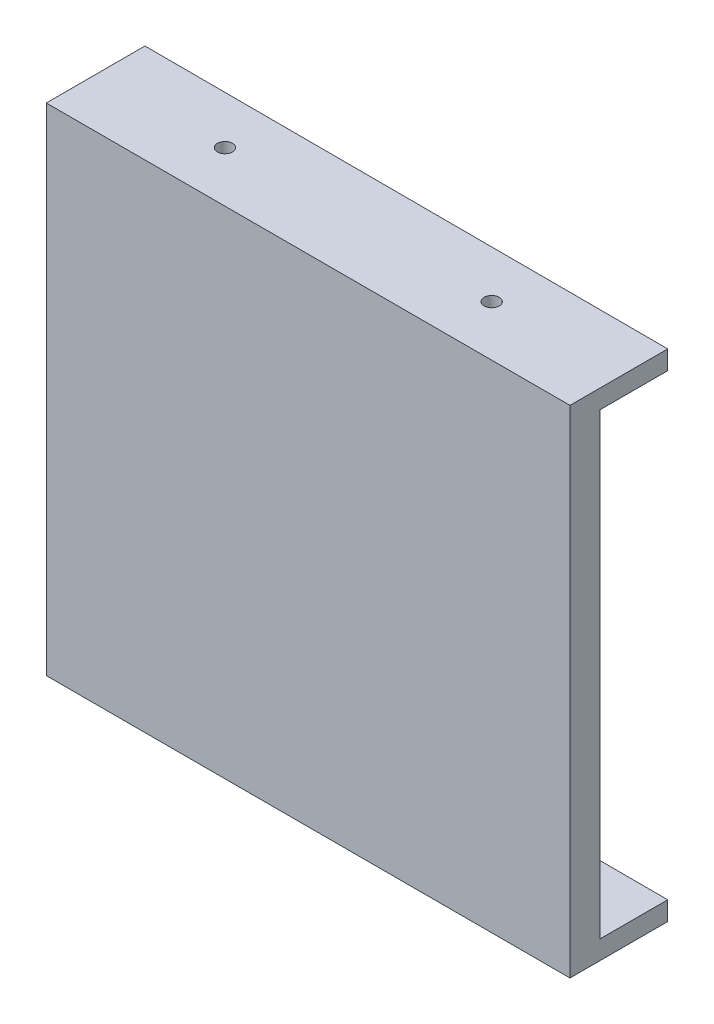
ISO-10303-21;
HEADER;
FILE_DESCRIPTION(('STEP AP214'),'2;1');
FILE_NAME('part.step','',(''),(''),'','','');
FILE_SCHEMA(('AUTOMOTIVE_DESIGN { 1 0 10303 214 1 1 1 1 }'));
ENDSEC;
DATA;
#1=APPLICATION_CONTEXT('core data for automotive mechanical design processes');
#2=APPLICATION_PROTOCOL_DEFINITION('international standard','automotive_design',2000,#1);
#3=PRODUCT_CONTEXT('',#1,'mechanical');
#4=PRODUCT('Part','Part','',(#3));
#5=PRODUCT_RELATED_PRODUCT_CATEGORY('part','',(#4));
#6=PRODUCT_DEFINITION_FORMATION('','',#4);
#7=PRODUCT_DEFINITION_CONTEXT('part definition',#1,'design');
#8=PRODUCT_DEFINITION('design','',#6,#7);
#9=PRODUCT_DEFINITION_SHAPE('','',#8);
#10=(LENGTH_UNIT() NAMED_UNIT(*) SI_UNIT(.MILLI.,.METRE.));
#11=(NAMED_UNIT(*) PLANE_ANGLE_UNIT() SI_UNIT($,.RADIAN.));
#12=(NAMED_UNIT(*) SI_UNIT($,.STERADIAN.) SOLID_ANGLE_UNIT());
#13=UNCERTAINTY_MEASURE_WITH_UNIT(LENGTH_MEASURE(1.E-05),#10,'distance_accuracy_value','');
#14=(GEOMETRIC_REPRESENTATION_CONTEXT(3) GLOBAL_UNCERTAINTY_ASSIGNED_CONTEXT((#13)) GLOBAL_UNIT_ASSIGNED_CONTEXT((#10,
#11,#12)) REPRESENTATION_CONTEXT('',''));
#15=CARTESIAN_POINT('',(0.,0.,0.));
#16=DIRECTION('',(0.,0.,1.));
#17=DIRECTION('',(1.,0.,0.));
#18=AXIS2_PLACEMENT_3D('',#15,#16,#17);
#19=CARTESIAN_POINT('',(52.325901310465,-131.475201728889,-26.1629504065637));
#20=DIRECTION('',(-0.00180058932844501,0.,0.999998378937721));
#21=DIRECTION('',(0.999998378937721,0.,0.00180058932844501));
#22=AXIS2_PLACEMENT_3D('',#19,#20,#21);
#23=PLANE('',#22);
#24=DIRECTION('',(-0.999998378937721,0.,-0.00180058932844501));
#25=VECTOR('',#24,1.);
#26=CARTESIAN_POINT('',(52.0759654345378,-131.475201728889,-26.1634004391642));
#27=LINE('',#26,#25);
#28=CARTESIAN_POINT('',(191.168830920369,-131.475201728889,-25.9129509039133));
#29=VERTEX_POINT('',#28);
#30=CARTESIAN_POINT('',(135.61271205082,-131.475201728889,-26.0129848208408));
#31=VERTEX_POINT('',#30);
#32=EDGE_CURVE('E161',#29,#31,#27,.T.);
#33=ORIENTED_EDGE('',*,*,#32,.T.);
#34=DIRECTION('',(0.,-1.,0.));
#35=VECTOR('',#34,1.);
#36=CARTESIAN_POINT('',(135.61271205082,0.001000000000001,-26.0129848208408));
#37=LINE('',#36,#35);
#38=CARTESIAN_POINT('',(135.61271205082,-126.475201728889,-26.0129848208408));
#39=VERTEX_POINT('',#38);
#40=EDGE_CURVE('E236',#39,#31,#37,.T.);
#41=ORIENTED_EDGE('',*,*,#40,.F.);
#42=DIRECTION('',(0.999998378937721,0.,0.00180058932844501));
#43=VECTOR('',#42,1.);
#44=CARTESIAN_POINT('',(52.0759654345378,-126.475201728889,-26.1634004391642));
#45=LINE('',#44,#43);
#46=CARTESIAN_POINT('',(191.168830920369,-126.475201728889,-25.9129509039133));
#47=VERTEX_POINT('',#46);
#48=EDGE_CURVE('E149',#39,#47,#45,.T.);
#49=ORIENTED_EDGE('',*,*,#48,.T.);
#50=DIRECTION('',(0.,-1.,0.));
#51=VECTOR('',#50,1.);
#52=CARTESIAN_POINT('',(191.168830920369,-131.475201728889,-25.9129509039133));
#53=LINE('',#52,#51);
#54=EDGE_CURVE('E153',#47,#29,#53,.T.);
#55=ORIENTED_EDGE('',*,*,#54,.T.);
#56=EDGE_LOOP('',(#33,#41,#49,#55));
#57=FACE_BOUND('',#56,.T.);
#58=ADVANCED_FACE('F36',(#57),#23,.F.);
#59=CARTESIAN_POINT('',(52.3259013104651,0.,-8.));
#60=DIRECTION('',(-1.,0.,0.));
#61=DIRECTION('',(0.,0.,1.));
#62=AXIS2_PLACEMENT_3D('',#59,#60,#61);
#63=PLANE('',#62);
#64=DIRECTION('',(0.,-1.,0.));
#65=VECTOR('',#64,1.);
#66=CARTESIAN_POINT('',(52.3259013104651,0.,-8.));
#67=LINE('',#66,#65);
#68=CARTESIAN_POINT('',(52.3259013104651,-5.,-8.00000000000001));
#69=VERTEX_POINT('',#68);
#70=CARTESIAN_POINT('',(52.3259013104651,-126.475201728889,-8.00000000000001));
#71=VERTEX_POINT('',#70);
#72=EDGE_CURVE('E186',#69,#71,#67,.T.);
#73=ORIENTED_EDGE('',*,*,#72,.T.);
#74=DIRECTION('',(0.,0.,1.));
#75=VECTOR('',#74,1.);
#76=CARTESIAN_POINT('',(52.3259013104651,-126.475201728889,-164.970993496207));
#77=LINE('',#76,#75);
#78=CARTESIAN_POINT('',(52.3259013104651,-126.475201728889,-26.1629504065637));
#79=VERTEX_POINT('',#78);
#80=EDGE_CURVE('E157',#79,#71,#77,.T.);
#81=ORIENTED_EDGE('',*,*,#80,.F.);
#82=DIRECTION('',(0.,1.,0.));
#83=VECTOR('',#82,1.);
#84=CARTESIAN_POINT('',(52.3259013104651,-131.475201728889,-26.1629504065637));
#85=LINE('',#84,#83);
#86=CARTESIAN_POINT('',(52.3259013104651,-131.475201728889,-26.1629504065637));
#87=VERTEX_POINT('',#86);
#88=EDGE_CURVE('E148',#87,#79,#85,.T.);
#89=ORIENTED_EDGE('',*,*,#88,.F.);
#90=DIRECTION('',(0.,0.,1.));
#91=VECTOR('',#90,1.);
#92=CARTESIAN_POINT('',(52.3259013104651,-131.475201728889,-8.));
#93=LINE('',#92,#91);
#94=CARTESIAN_POINT('',(52.3259013104651,-131.475201728889,0.));
#95=VERTEX_POINT('',#94);
#96=EDGE_CURVE('E191',#87,#95,#93,.T.);
#97=ORIENTED_EDGE('',*,*,#96,.T.);
#98=DIRECTION('',(0.,-1.,0.));
#99=VECTOR('',#98,1.);
#100=CARTESIAN_POINT('',(52.3259013104651,0.,0.));
#101=LINE('',#100,#99);
#102=CARTESIAN_POINT('',(52.3259013104651,0.,0.));
#103=VERTEX_POINT('',#102);
#104=EDGE_CURVE('E185',#103,#95,#101,.T.);
#105=ORIENTED_EDGE('',*,*,#104,.F.);
#106=DIRECTION('',(0.,0.,1.));
#107=VECTOR('',#106,1.);
#108=CARTESIAN_POINT('',(52.3259013104651,0.,-8.));
#109=LINE('',#108,#107);
#110=CARTESIAN_POINT('',(52.3259013104651,0.,-26.1629504065637));
#111=VERTEX_POINT('',#110);
#112=EDGE_CURVE('E11',#111,#103,#109,.T.);
#113=ORIENTED_EDGE('',*,*,#112,.F.);
#114=DIRECTION('',(0.,1.,0.));
#115=VECTOR('',#114,1.);
#116=CARTESIAN_POINT('',(52.3259013104651,0.,-26.1629504065637));
#117=LINE('',#116,#115);
#118=CARTESIAN_POINT('',(52.3259013104651,-5.,-26.1629504065637));
#119=VERTEX_POINT('',#118);
#120=EDGE_CURVE('E174',#119,#111,#117,.T.);
#121=ORIENTED_EDGE('',*,*,#120,.F.);
#122=DIRECTION('',(0.,0.,1.));
#123=VECTOR('',#122,1.);
#124=CARTESIAN_POINT('',(52.3259013104651,-5.,-164.970993496207));
#125=LINE('',#124,#123);
#126=EDGE_CURVE('E167',#119,#69,#125,.T.);
#127=ORIENTED_EDGE('',*,*,#126,.T.);
#128=EDGE_LOOP('',(#73,#81,#89,#97,#105,#113,#121,#127));
#129=FACE_BOUND('',#128,.T.);
#130=ADVANCED_FACE('F38',(#129),#63,.T.);
#131=CARTESIAN_POINT('',(52.3259013104651,0.,-8.));
#132=DIRECTION('',(0.,1.,0.));
#133=DIRECTION('',(0.,0.,1.));
#134=AXIS2_PLACEMENT_3D('',#131,#132,#133);
#135=PLANE('',#134);
#136=CARTESIAN_POINT('',(86.2670273047564,0.,-13.4350288425471));
#137=DIRECTION('',(0.,-1.,0.));
#138=DIRECTION('',(0.,0.,-1.));
#139=AXIS2_PLACEMENT_3D('',#136,#137,#138);
#140=CIRCLE('',#139,1.99999999999897);
#141=CARTESIAN_POINT('',(86.2670273047564,0.,-15.4350288425461));
#142=VERTEX_POINT('',#141);
#143=EDGE_CURVE('E208',#142,#142,#140,.T.);
#144=ORIENTED_EDGE('',*,*,#143,.T.);
#145=EDGE_LOOP('',(#144));
#146=FACE_BOUND('',#145,.T.);
#147=CARTESIAN_POINT('',(156.977705423411,0.,-13.4350288425517));
#148=DIRECTION('',(0.,-1.,0.));
#149=DIRECTION('',(0.,0.,-1.));
#150=AXIS2_PLACEMENT_3D('',#147,#148,#149);
#151=CIRCLE('',#150,1.99999999999892);
#152=CARTESIAN_POINT('',(156.977705423411,0.,-15.4350288425507));
#153=VERTEX_POINT('',#152);
#154=EDGE_CURVE('E219',#153,#153,#151,.T.);
#155=ORIENTED_EDGE('',*,*,#154,.T.);
#156=EDGE_LOOP('',(#155));
#157=FACE_BOUND('',#156,.T.);
#158=DIRECTION('',(-1.,0.,0.));
#159=VECTOR('',#158,1.);
#160=CARTESIAN_POINT('',(52.3259013104651,0.,0.));
#161=LINE('',#160,#159);
#162=CARTESIAN_POINT('',(191.168830920369,0.,0.));
#163=VERTEX_POINT('',#162);
#164=EDGE_CURVE('E189',#163,#103,#161,.T.);
#165=ORIENTED_EDGE('',*,*,#164,.F.);
#166=DIRECTION('',(0.,0.,1.));
#167=VECTOR('',#166,1.);
#168=CARTESIAN_POINT('',(191.168830920369,0.,-8.));
#169=LINE('',#168,#167);
#170=CARTESIAN_POINT('',(191.168830920369,0.,-25.9129509039132));
#171=VERTEX_POINT('',#170);
#172=EDGE_CURVE('E45',#171,#163,#169,.T.);
#173=ORIENTED_EDGE('',*,*,#172,.F.);
#174=DIRECTION('',(0.999998378937721,0.,0.00180058932844501));
#175=VECTOR('',#174,1.);
#176=CARTESIAN_POINT('',(52.0759654345378,0.,-26.1634004391642));
#177=LINE('',#176,#175);
#178=EDGE_CURVE('E170',#111,#171,#177,.T.);
#179=ORIENTED_EDGE('',*,*,#178,.F.);
#180=ORIENTED_EDGE('',*,*,#112,.T.);
#181=EDGE_LOOP('',(#165,#173,#179,#180));
#182=FACE_BOUND('',#181,.T.);
#183=ADVANCED_FACE('F273',(#146,#157,#182),#135,.T.);
#184=CARTESIAN_POINT('',(191.168830920369,0.,-8.));
#185=DIRECTION('',(1.,0.,0.));
#186=DIRECTION('',(0.,0.,-1.));
#187=AXIS2_PLACEMENT_3D('',#184,#185,#186);
#188=PLANE('',#187);
#189=ORIENTED_EDGE('',*,*,#172,.T.);
#190=DIRECTION('',(0.,1.,0.));
#191=VECTOR('',#190,1.);
#192=CARTESIAN_POINT('',(191.168830920369,0.,0.));
#193=LINE('',#192,#191);
#194=CARTESIAN_POINT('',(191.168830920369,-131.475201728889,0.));
#195=VERTEX_POINT('',#194);
#196=EDGE_CURVE('E196',#195,#163,#193,.T.);
#197=ORIENTED_EDGE('',*,*,#196,.F.);
#198=DIRECTION('',(0.,0.,1.));
#199=VECTOR('',#198,1.);
#200=CARTESIAN_POINT('',(191.168830920369,-131.475201728889,-8.));
#201=LINE('',#200,#199);
#202=EDGE_CURVE('E202',#29,#195,#201,.T.);
#203=ORIENTED_EDGE('',*,*,#202,.F.);
#204=ORIENTED_EDGE('',*,*,#54,.F.);
#205=DIRECTION('',(0.,0.,1.));
#206=VECTOR('',#205,1.);
#207=CARTESIAN_POINT('',(191.168830920369,-126.475201728889,-164.970993496207));
#208=LINE('',#207,#206);
#209=CARTESIAN_POINT('',(191.168830920369,-126.475201728889,-8.00000000000001));
#210=VERTEX_POINT('',#209);
#211=EDGE_CURVE('E159',#47,#210,#208,.T.);
#212=ORIENTED_EDGE('',*,*,#211,.T.);
#213=DIRECTION('',(0.,1.,0.));
#214=VECTOR('',#213,1.);
#215=CARTESIAN_POINT('',(191.168830920369,0.,-8.));
#216=LINE('',#215,#214);
#217=CARTESIAN_POINT('',(191.168830920369,-5.,-8.));
#218=VERTEX_POINT('',#217);
#219=EDGE_CURVE('E61',#210,#218,#216,.T.);
#220=ORIENTED_EDGE('',*,*,#219,.T.);
#221=DIRECTION('',(0.,0.,1.));
#222=VECTOR('',#221,1.);
#223=CARTESIAN_POINT('',(191.168830920369,-5.,-164.970993496207));
#224=LINE('',#223,#222);
#225=CARTESIAN_POINT('',(191.168830920369,-5.,-25.9129509039132));
#226=VERTEX_POINT('',#225);
#227=EDGE_CURVE('E171',#226,#218,#224,.T.);
#228=ORIENTED_EDGE('',*,*,#227,.F.);
#229=DIRECTION('',(0.,-1.,0.));
#230=VECTOR('',#229,1.);
#231=CARTESIAN_POINT('',(191.168830920369,0.,-25.9129509039132));
#232=LINE('',#231,#230);
#233=EDGE_CURVE('E168',#171,#226,#232,.T.);
#234=ORIENTED_EDGE('',*,*,#233,.F.);
#235=EDGE_LOOP('',(#189,#197,#203,#204,#212,#220,#228,#234));
#236=FACE_BOUND('',#235,.T.);
#237=ADVANCED_FACE('F304',(#236),#188,.T.);
#238=CARTESIAN_POINT('',(52.3259013104651,-131.475201728889,-8.));
#239=DIRECTION('',(0.,-1.,0.));
#240=DIRECTION('',(0.,0.,-1.));
#241=AXIS2_PLACEMENT_3D('',#238,#239,#240);
#242=PLANE('',#241);
#243=CARTESIAN_POINT('',(86.2670273047564,-131.475201728889,-13.4350288425471));
#244=DIRECTION('',(0.,-1.,0.));
#245=DIRECTION('',(0.,0.,-1.));
#246=AXIS2_PLACEMENT_3D('',#243,#244,#245);
#247=CIRCLE('',#246,1.99999999999897);
#248=CARTESIAN_POINT('',(86.2670273047564,-131.475201728889,-15.4350288425461));
#249=VERTEX_POINT('',#248);
#250=EDGE_CURVE('E214',#249,#249,#247,.T.);
#251=ORIENTED_EDGE('',*,*,#250,.F.);
#252=EDGE_LOOP('',(#251));
#253=FACE_BOUND('',#252,.T.);
#254=CARTESIAN_POINT('',(156.977705423411,-131.475201728889,-13.4350288425517));
#255=DIRECTION('',(0.,-1.,0.));
#256=DIRECTION('',(0.,0.,-1.));
#257=AXIS2_PLACEMENT_3D('',#254,#255,#256);
#258=CIRCLE('',#257,1.99999999999892);
#259=CARTESIAN_POINT('',(156.977705423411,-131.475201728889,-15.4350288425507));
#260=VERTEX_POINT('',#259);
#261=EDGE_CURVE('E224',#260,#260,#258,.T.);
#262=ORIENTED_EDGE('',*,*,#261,.F.);
#263=EDGE_LOOP('',(#262));
#264=FACE_BOUND('',#263,.T.);
#265=DIRECTION('',(-0.499999999999943,0.,0.866025403784471));
#266=VECTOR('',#265,1.);
#267=CARTESIAN_POINT('',(135.61271205082,-131.475201728889,-26.0129848208408));
#268=LINE('',#267,#266);
#269=CARTESIAN_POINT('',(128.698898599307,-131.475201728889,-14.0379086487658));
#270=VERTEX_POINT('',#269);
#271=EDGE_CURVE('E144',#31,#270,#268,.T.);
#272=ORIENTED_EDGE('',*,*,#271,.F.);
#273=ORIENTED_EDGE('',*,*,#32,.F.);
#274=ORIENTED_EDGE('',*,*,#202,.T.);
#275=DIRECTION('',(1.,0.,0.));
#276=VECTOR('',#275,1.);
#277=CARTESIAN_POINT('',(52.3259013104651,-131.475201728889,0.));
#278=LINE('',#277,#276);
#279=EDGE_CURVE('E193',#95,#195,#278,.T.);
#280=ORIENTED_EDGE('',*,*,#279,.F.);
#281=ORIENTED_EDGE('',*,*,#96,.F.);
#282=CARTESIAN_POINT('',(108.015470014398,-131.475201728889,-26.0626762008989));
#283=VERTEX_POINT('',#282);
#284=EDGE_CURVE('E151',#283,#87,#27,.T.);
#285=ORIENTED_EDGE('',*,*,#284,.F.);
#286=DIRECTION('',(-0.493723338952933,0.,-0.869619034159883));
#287=VECTOR('',#286,1.);
#288=CARTESIAN_POINT('',(114.842492138756,-131.475201728889,-14.0379086487649));
#289=LINE('',#288,#287);
#290=CARTESIAN_POINT('',(114.842492138756,-131.475201728889,-14.0379086487649));
#291=VERTEX_POINT('',#290);
#292=EDGE_CURVE('E53',#291,#283,#289,.T.);
#293=ORIENTED_EDGE('',*,*,#292,.F.);
#294=DIRECTION('',(-1.,0.,0.));
#295=VECTOR('',#294,1.);
#296=CARTESIAN_POINT('',(128.698898599307,-131.475201728889,-14.0379086487658));
#297=LINE('',#296,#295);
#298=EDGE_CURVE('E233',#270,#291,#297,.T.);
#299=ORIENTED_EDGE('',*,*,#298,.F.);
#300=EDGE_LOOP('',(#272,#273,#274,#280,#281,#285,#293,#299));
#301=FACE_BOUND('',#300,.T.);
#302=ADVANCED_FACE('F253',(#253,#264,#301),#242,.T.);
#303=CARTESIAN_POINT('',(0.,0.,-8.));
#304=DIRECTION('',(0.,0.,1.));
#305=DIRECTION('',(1.,0.,0.));
#306=AXIS2_PLACEMENT_3D('',#303,#304,#305);
#307=PLANE('',#306);
#308=ORIENTED_EDGE('',*,*,#219,.F.);
#309=DIRECTION('',(-1.,0.,0.));
#310=VECTOR('',#309,1.);
#311=CARTESIAN_POINT('',(0.,-126.475201728889,-8.));
#312=LINE('',#311,#310);
#313=EDGE_CURVE('E164',#210,#71,#312,.T.);
#314=ORIENTED_EDGE('',*,*,#313,.T.);
#315=ORIENTED_EDGE('',*,*,#72,.F.);
#316=DIRECTION('',(1.,0.,0.));
#317=VECTOR('',#316,1.);
#318=CARTESIAN_POINT('',(0.,-5.,-8.));
#319=LINE('',#318,#317);
#320=EDGE_CURVE('E182',#69,#218,#319,.T.);
#321=ORIENTED_EDGE('',*,*,#320,.T.);
#322=EDGE_LOOP('',(#308,#314,#315,#321));
#323=FACE_BOUND('',#322,.T.);
#324=ADVANCED_FACE('F295',(#323),#307,.F.);
#325=CARTESIAN_POINT('',(0.,0.,0.));
#326=DIRECTION('',(0.,0.,1.));
#327=DIRECTION('',(1.,0.,0.));
#328=AXIS2_PLACEMENT_3D('',#325,#326,#327);
#329=PLANE('',#328);
#330=ORIENTED_EDGE('',*,*,#104,.T.);
#331=ORIENTED_EDGE('',*,*,#279,.T.);
#332=ORIENTED_EDGE('',*,*,#196,.T.);
#333=ORIENTED_EDGE('',*,*,#164,.T.);
#334=EDGE_LOOP('',(#330,#331,#332,#333));
#335=FACE_BOUND('',#334,.T.);
#336=ADVANCED_FACE('F293',(#335),#329,.T.);
#337=CARTESIAN_POINT('',(52.3259013104651,-5.,-164.970993496207));
#338=DIRECTION('',(0.,-1.,0.));
#339=DIRECTION('',(0.,0.,-1.));
#340=AXIS2_PLACEMENT_3D('',#337,#338,#339);
#341=PLANE('',#340);
#342=CARTESIAN_POINT('',(86.2670273047564,-5.,-13.4350288425471));
#343=DIRECTION('',(0.,-1.,0.));
#344=DIRECTION('',(0.,0.,-1.));
#345=AXIS2_PLACEMENT_3D('',#342,#343,#344);
#346=CIRCLE('',#345,1.99999999999897);
#347=CARTESIAN_POINT('',(86.2670273047564,-5.,-15.4350288425461));
#348=VERTEX_POINT('',#347);
#349=EDGE_CURVE('E227',#348,#348,#346,.T.);
#350=ORIENTED_EDGE('',*,*,#349,.F.);
#351=EDGE_LOOP('',(#350));
#352=FACE_BOUND('',#351,.T.);
#353=CARTESIAN_POINT('',(156.977705423411,-5.,-13.4350288425517));
#354=DIRECTION('',(0.,-1.,0.));
#355=DIRECTION('',(0.,0.,-1.));
#356=AXIS2_PLACEMENT_3D('',#353,#354,#355);
#357=CIRCLE('',#356,1.99999999999892);
#358=CARTESIAN_POINT('',(156.977705423411,-5.,-15.4350288425507));
#359=VERTEX_POINT('',#358);
#360=EDGE_CURVE('E207',#359,#359,#357,.T.);
#361=ORIENTED_EDGE('',*,*,#360,.F.);
#362=EDGE_LOOP('',(#361));
#363=FACE_BOUND('',#362,.T.);
#364=ORIENTED_EDGE('',*,*,#320,.F.);
#365=ORIENTED_EDGE('',*,*,#126,.F.);
#366=DIRECTION('',(-0.999998378937721,0.,-0.00180058932844501));
#367=VECTOR('',#366,1.);
#368=CARTESIAN_POINT('',(52.0759654345378,-5.,-26.1634004391642));
#369=LINE('',#368,#367);
#370=EDGE_CURVE('E177',#226,#119,#369,.T.);
#371=ORIENTED_EDGE('',*,*,#370,.F.);
#372=ORIENTED_EDGE('',*,*,#227,.T.);
#373=EDGE_LOOP('',(#364,#365,#371,#372));
#374=FACE_BOUND('',#373,.T.);
#375=ADVANCED_FACE('F285',(#352,#363,#374),#341,.T.);
#376=CARTESIAN_POINT('',(52.325901310465,-131.475201728889,-26.1629504065637));
#377=DIRECTION('',(-0.00180058932844501,0.,0.999998378937721));
#378=DIRECTION('',(0.999998378937721,0.,0.00180058932844501));
#379=AXIS2_PLACEMENT_3D('',#376,#377,#378);
#380=PLANE('',#379);
#381=ORIENTED_EDGE('',*,*,#120,.T.);
#382=ORIENTED_EDGE('',*,*,#178,.T.);
#383=ORIENTED_EDGE('',*,*,#233,.T.);
#384=ORIENTED_EDGE('',*,*,#370,.T.);
#385=EDGE_LOOP('',(#381,#382,#383,#384));
#386=FACE_BOUND('',#385,.T.);
#387=ADVANCED_FACE('F280',(#386),#380,.F.);
#388=CARTESIAN_POINT('',(52.3259013104651,-126.475201728889,-164.970993496207));
#389=DIRECTION('',(0.,1.,0.));
#390=DIRECTION('',(0.,0.,1.));
#391=AXIS2_PLACEMENT_3D('',#388,#389,#390);
#392=PLANE('',#391);
#393=CARTESIAN_POINT('',(86.2670273047564,-126.475201728889,-13.4350288425471));
#394=DIRECTION('',(0.,1.,0.));
#395=DIRECTION('',(0.,0.,1.));
#396=AXIS2_PLACEMENT_3D('',#393,#394,#395);
#397=CIRCLE('',#396,1.99999999999897);
#398=CARTESIAN_POINT('',(86.2670273047564,-126.475201728889,-11.4350288425482));
#399=VERTEX_POINT('',#398);
#400=EDGE_CURVE('E40',#399,#399,#397,.T.);
#401=ORIENTED_EDGE('',*,*,#400,.F.);
#402=EDGE_LOOP('',(#401));
#403=FACE_BOUND('',#402,.T.);
#404=CARTESIAN_POINT('',(156.977705423411,-126.475201728889,-13.4350288425517));
#405=DIRECTION('',(0.,1.,0.));
#406=DIRECTION('',(0.,0.,1.));
#407=AXIS2_PLACEMENT_3D('',#404,#405,#406);
#408=CIRCLE('',#407,1.99999999999892);
#409=CARTESIAN_POINT('',(156.977705423411,-126.475201728889,-11.4350288425528));
#410=VERTEX_POINT('',#409);
#411=EDGE_CURVE('E205',#410,#410,#408,.T.);
#412=ORIENTED_EDGE('',*,*,#411,.F.);
#413=EDGE_LOOP('',(#412));
#414=FACE_BOUND('',#413,.T.);
#415=DIRECTION('',(-0.499999999999943,0.,0.866025403784471));
#416=VECTOR('',#415,1.);
#417=CARTESIAN_POINT('',(135.61271205082,-126.475201728889,-26.0129848208408));
#418=LINE('',#417,#416);
#419=CARTESIAN_POINT('',(128.698898599307,-126.475201728889,-14.0379086487658));
#420=VERTEX_POINT('',#419);
#421=EDGE_CURVE('E133',#39,#420,#418,.T.);
#422=ORIENTED_EDGE('',*,*,#421,.T.);
#423=DIRECTION('',(-1.,0.,0.));
#424=VECTOR('',#423,1.);
#425=CARTESIAN_POINT('',(128.698898599307,-126.475201728889,-14.0379086487658));
#426=LINE('',#425,#424);
#427=CARTESIAN_POINT('',(114.842492138756,-126.475201728889,-14.0379086487649));
#428=VERTEX_POINT('',#427);
#429=EDGE_CURVE('E143',#420,#428,#426,.T.);
#430=ORIENTED_EDGE('',*,*,#429,.T.);
#431=DIRECTION('',(-0.493723338952933,0.,-0.869619034159883));
#432=VECTOR('',#431,1.);
#433=CARTESIAN_POINT('',(114.842492138756,-126.475201728889,-14.0379086487649));
#434=LINE('',#433,#432);
#435=CARTESIAN_POINT('',(108.015470014398,-126.475201728889,-26.0626762008989));
#436=VERTEX_POINT('',#435);
#437=EDGE_CURVE('E128',#428,#436,#434,.T.);
#438=ORIENTED_EDGE('',*,*,#437,.T.);
#439=EDGE_CURVE('E141',#79,#436,#45,.T.);
#440=ORIENTED_EDGE('',*,*,#439,.F.);
#441=ORIENTED_EDGE('',*,*,#80,.T.);
#442=ORIENTED_EDGE('',*,*,#313,.F.);
#443=ORIENTED_EDGE('',*,*,#211,.F.);
#444=ORIENTED_EDGE('',*,*,#48,.F.);
#445=EDGE_LOOP('',(#422,#430,#438,#440,#441,#442,#443,#444));
#446=FACE_BOUND('',#445,.T.);
#447=ADVANCED_FACE('F140',(#403,#414,#446),#392,.T.);
#448=ORIENTED_EDGE('',*,*,#439,.T.);
#449=DIRECTION('',(0.,-1.,0.));
#450=VECTOR('',#449,1.);
#451=CARTESIAN_POINT('',(108.015470014398,0.001000000000001,-26.0626762008989));
#452=LINE('',#451,#450);
#453=EDGE_CURVE('E125',#436,#283,#452,.T.);
#454=ORIENTED_EDGE('',*,*,#453,.T.);
#455=ORIENTED_EDGE('',*,*,#284,.T.);
#456=ORIENTED_EDGE('',*,*,#88,.T.);
#457=EDGE_LOOP('',(#448,#454,#455,#456));
#458=FACE_BOUND('',#457,.T.);
#459=ADVANCED_FACE('F146',(#458),#23,.F.);
#460=CARTESIAN_POINT('',(135.61271205082,0.001000000000001,-26.0129848208408));
#461=DIRECTION('',(0.866025403784471,0.,0.499999999999943));
#462=DIRECTION('',(0.499999999999943,0.,-0.866025403784471));
#463=AXIS2_PLACEMENT_3D('',#460,#461,#462);
#464=PLANE('',#463);
#465=ORIENTED_EDGE('',*,*,#40,.T.);
#466=ORIENTED_EDGE('',*,*,#271,.T.);
#467=DIRECTION('',(0.,-1.,0.));
#468=VECTOR('',#467,1.);
#469=CARTESIAN_POINT('',(128.698898599307,0.001000000000001,-14.0379086487658));
#470=LINE('',#469,#468);
#471=EDGE_CURVE('E239',#420,#270,#470,.T.);
#472=ORIENTED_EDGE('',*,*,#471,.F.);
#473=ORIENTED_EDGE('',*,*,#421,.F.);
#474=EDGE_LOOP('',(#465,#466,#472,#473));
#475=FACE_BOUND('',#474,.T.);
#476=ADVANCED_FACE('F246',(#475),#464,.F.);
#477=CARTESIAN_POINT('',(128.698898599307,0.001000000000001,-14.0379086487658));
#478=DIRECTION('',(0.,0.,1.));
#479=DIRECTION('',(1.,0.,0.));
#480=AXIS2_PLACEMENT_3D('',#477,#478,#479);
#481=PLANE('',#480);
#482=ORIENTED_EDGE('',*,*,#471,.T.);
#483=ORIENTED_EDGE('',*,*,#298,.T.);
#484=DIRECTION('',(0.,-1.,0.));
#485=VECTOR('',#484,1.);
#486=CARTESIAN_POINT('',(114.842492138756,0.001000000000001,-14.0379086487649));
#487=LINE('',#486,#485);
#488=EDGE_CURVE('E134',#428,#291,#487,.T.);
#489=ORIENTED_EDGE('',*,*,#488,.F.);
#490=ORIENTED_EDGE('',*,*,#429,.F.);
#491=EDGE_LOOP('',(#482,#483,#489,#490));
#492=FACE_BOUND('',#491,.T.);
#493=ADVANCED_FACE('F258',(#492),#481,.F.);
#494=CARTESIAN_POINT('',(114.842492138756,0.001000000000001,-14.0379086487649));
#495=DIRECTION('',(-0.869619034159883,0.,0.493723338952933));
#496=DIRECTION('',(0.493723338952933,0.,0.869619034159883));
#497=AXIS2_PLACEMENT_3D('',#494,#495,#496);
#498=PLANE('',#497);
#499=ORIENTED_EDGE('',*,*,#488,.T.);
#500=ORIENTED_EDGE('',*,*,#292,.T.);
#501=ORIENTED_EDGE('',*,*,#453,.F.);
#502=ORIENTED_EDGE('',*,*,#437,.F.);
#503=EDGE_LOOP('',(#499,#500,#501,#502));
#504=FACE_BOUND('',#503,.T.);
#505=ADVANCED_FACE('F127',(#504),#498,.F.);
#506=CARTESIAN_POINT('',(156.977705423411,0.,-13.4350288425517));
#507=DIRECTION('',(0.,-1.,0.));
#508=DIRECTION('',(0.,0.,-1.));
#509=AXIS2_PLACEMENT_3D('',#506,#507,#508);
#510=CYLINDRICAL_SURFACE('',#509,1.99999999999892);
#511=ORIENTED_EDGE('',*,*,#411,.T.);
#512=EDGE_LOOP('',(#511));
#513=FACE_BOUND('',#512,.T.);
#514=ORIENTED_EDGE('',*,*,#261,.T.);
#515=EDGE_LOOP('',(#514));
#516=FACE_BOUND('',#515,.T.);
#517=ADVANCED_FACE('F265',(#513,#516),#510,.F.);
#518=CARTESIAN_POINT('',(86.2670273047564,0.,-13.4350288425471));
#519=DIRECTION('',(0.,-1.,0.));
#520=DIRECTION('',(0.,0.,-1.));
#521=AXIS2_PLACEMENT_3D('',#518,#519,#520);
#522=CYLINDRICAL_SURFACE('',#521,1.99999999999897);
#523=ORIENTED_EDGE('',*,*,#400,.T.);
#524=EDGE_LOOP('',(#523));
#525=FACE_BOUND('',#524,.T.);
#526=ORIENTED_EDGE('',*,*,#250,.T.);
#527=EDGE_LOOP('',(#526));
#528=FACE_BOUND('',#527,.T.);
#529=ADVANCED_FACE('F315',(#525,#528),#522,.F.);
#530=ORIENTED_EDGE('',*,*,#360,.T.);
#531=EDGE_LOOP('',(#530));
#532=FACE_BOUND('',#531,.T.);
#533=ORIENTED_EDGE('',*,*,#154,.F.);
#534=EDGE_LOOP('',(#533));
#535=FACE_BOUND('',#534,.T.);
#536=ADVANCED_FACE('F317',(#532,#535),#510,.F.);
#537=ORIENTED_EDGE('',*,*,#349,.T.);
#538=EDGE_LOOP('',(#537));
#539=FACE_BOUND('',#538,.T.);
#540=ORIENTED_EDGE('',*,*,#143,.F.);
#541=EDGE_LOOP('',(#540));
#542=FACE_BOUND('',#541,.T.);
#543=ADVANCED_FACE('F323',(#539,#542),#522,.F.);
#544=CLOSED_SHELL('',(#58,#130,#183,#237,#302,#324,#336,#375,#387,#447,#459,#476,#493,#505,#517,
#529,#536,#543));
#545=MANIFOLD_SOLID_BREP('B2',#544);
#546=ADVANCED_BREP_SHAPE_REPRESENTATION('',(#18,#545),#14);
#547=SHAPE_DEFINITION_REPRESENTATION(#9,#546);
ENDSEC;
END-ISO-10303-21;
